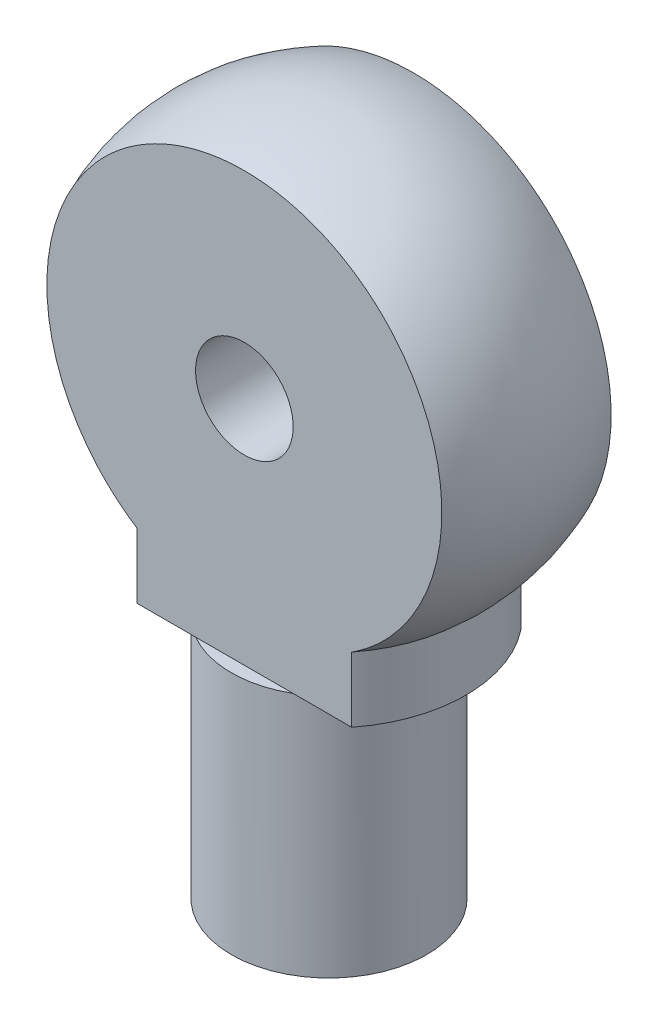
ISO-10303-21;
HEADER;
FILE_DESCRIPTION(('STEP AP214'),'2;1');
FILE_NAME('part.step','',(''),(''),'','','');
FILE_SCHEMA(('AUTOMOTIVE_DESIGN { 1 0 10303 214 1 1 1 1 }'));
ENDSEC;
DATA;
#1=APPLICATION_CONTEXT('core data for automotive mechanical design processes');
#2=APPLICATION_PROTOCOL_DEFINITION('international standard','automotive_design',2000,#1);
#3=PRODUCT_CONTEXT('',#1,'mechanical');
#4=PRODUCT('Part','Part','',(#3));
#5=PRODUCT_RELATED_PRODUCT_CATEGORY('part','',(#4));
#6=PRODUCT_DEFINITION_FORMATION('','',#4);
#7=PRODUCT_DEFINITION_CONTEXT('part definition',#1,'design');
#8=PRODUCT_DEFINITION('design','',#6,#7);
#9=PRODUCT_DEFINITION_SHAPE('','',#8);
#10=(LENGTH_UNIT() NAMED_UNIT(*) SI_UNIT(.MILLI.,.METRE.));
#11=(NAMED_UNIT(*) PLANE_ANGLE_UNIT() SI_UNIT($,.RADIAN.));
#12=(NAMED_UNIT(*) SI_UNIT($,.STERADIAN.) SOLID_ANGLE_UNIT());
#13=UNCERTAINTY_MEASURE_WITH_UNIT(LENGTH_MEASURE(1.E-05),#10,'distance_accuracy_value','');
#14=(GEOMETRIC_REPRESENTATION_CONTEXT(3) GLOBAL_UNCERTAINTY_ASSIGNED_CONTEXT((#13)) GLOBAL_UNIT_ASSIGNED_CONTEXT((#10,
#11,#12)) REPRESENTATION_CONTEXT('',''));
#15=CARTESIAN_POINT('',(0.,0.,0.));
#16=DIRECTION('',(0.,0.,1.));
#17=DIRECTION('',(1.,0.,0.));
#18=AXIS2_PLACEMENT_3D('',#15,#16,#17);
#19=CARTESIAN_POINT('',(0.,19.05,10.668));
#20=DIRECTION('',(0.,1.,0.));
#21=DIRECTION('',(0.,0.,1.));
#22=AXIS2_PLACEMENT_3D('',#19,#20,#21);
#23=PLANE('',#22);
#24=CARTESIAN_POINT('',(0.,19.05,0.));
#25=DIRECTION('',(0.,-1.,0.));
#26=DIRECTION('',(0.,0.,-1.));
#27=AXIS2_PLACEMENT_3D('',#24,#25,#26);
#28=CIRCLE('',#27,10.668);
#29=CARTESIAN_POINT('',(8.37815063125509,19.05,-6.604));
#30=VERTEX_POINT('',#29);
#31=CARTESIAN_POINT('',(8.37815063125509,19.05,6.604));
#32=VERTEX_POINT('',#31);
#33=EDGE_CURVE('E112',#30,#32,#28,.T.);
#34=ORIENTED_EDGE('',*,*,#33,.T.);
#35=DIRECTION('',(1.,0.,0.));
#36=VECTOR('',#35,1.);
#37=CARTESIAN_POINT('',(-16.764,19.05,6.604));
#38=LINE('',#37,#36);
#39=CARTESIAN_POINT('',(3.80152390496232,19.05,6.604));
#40=VERTEX_POINT('',#39);
#41=EDGE_CURVE('E96',#40,#32,#38,.T.);
#42=ORIENTED_EDGE('',*,*,#41,.F.);
#43=CARTESIAN_POINT('',(0.,19.05,0.));
#44=DIRECTION('',(0.,1.,0.));
#45=DIRECTION('',(0.,0.,1.));
#46=AXIS2_PLACEMENT_3D('',#43,#44,#45);
#47=CIRCLE('',#46,7.62);
#48=CARTESIAN_POINT('',(3.80152390496232,19.05,-6.604));
#49=VERTEX_POINT('',#48);
#50=EDGE_CURVE('E123',#40,#49,#47,.T.);
#51=ORIENTED_EDGE('',*,*,#50,.T.);
#52=DIRECTION('',(1.,0.,0.));
#53=VECTOR('',#52,1.);
#54=CARTESIAN_POINT('',(-16.764,19.05,-6.604));
#55=LINE('',#54,#53);
#56=EDGE_CURVE('E98',#49,#30,#55,.T.);
#57=ORIENTED_EDGE('',*,*,#56,.T.);
#58=EDGE_LOOP('',(#34,#42,#51,#57));
#59=FACE_BOUND('',#58,.T.);
#60=ADVANCED_FACE('F33',(#59),#23,.F.);
#61=CARTESIAN_POINT('',(0.,19.05,0.));
#62=DIRECTION('',(0.,-1.,0.));
#63=DIRECTION('',(0.,0.,-1.));
#64=AXIS2_PLACEMENT_3D('',#61,#62,#63);
#65=CYLINDRICAL_SURFACE('',#64,10.668);
#66=CARTESIAN_POINT('',(0.,24.13,0.));
#67=DIRECTION('',(0.,-1.,0.));
#68=DIRECTION('',(0.,0.,-1.));
#69=AXIS2_PLACEMENT_3D('',#66,#67,#68);
#70=CIRCLE('',#69,10.668);
#71=CARTESIAN_POINT('',(8.37815063125509,24.13,-6.604));
#72=VERTEX_POINT('',#71);
#73=CARTESIAN_POINT('',(8.37815063125508,24.13,6.604));
#74=VERTEX_POINT('',#73);
#75=EDGE_CURVE('E119',#72,#74,#70,.T.);
#76=ORIENTED_EDGE('',*,*,#75,.T.);
#77=DIRECTION('',(0.,-1.,0.));
#78=VECTOR('',#77,1.);
#79=CARTESIAN_POINT('',(8.37815063125509,19.05,6.604));
#80=LINE('',#79,#78);
#81=EDGE_CURVE('E11',#74,#32,#80,.T.);
#82=ORIENTED_EDGE('',*,*,#81,.T.);
#83=ORIENTED_EDGE('',*,*,#33,.F.);
#84=DIRECTION('',(0.,-1.,0.));
#85=VECTOR('',#84,1.);
#86=CARTESIAN_POINT('',(8.37815063125509,19.05,-6.604));
#87=LINE('',#86,#85);
#88=EDGE_CURVE('E106',#30,#72,#87,.F.);
#89=ORIENTED_EDGE('',*,*,#88,.T.);
#90=EDGE_LOOP('',(#76,#82,#83,#89));
#91=FACE_BOUND('',#90,.T.);
#92=ADVANCED_FACE('F161',(#91),#65,.T.);
#93=CARTESIAN_POINT('',(0.,19.05,0.));
#94=DIRECTION('',(0.,-1.,0.));
#95=DIRECTION('',(0.,0.,-1.));
#96=AXIS2_PLACEMENT_3D('',#93,#94,#95);
#97=CYLINDRICAL_SURFACE('',#96,7.62);
#98=ORIENTED_EDGE('',*,*,#50,.F.);
#99=CARTESIAN_POINT('',(0.,19.05,0.));
#100=DIRECTION('',(0.,-1.,0.));
#101=DIRECTION('',(0.,0.,-1.));
#102=AXIS2_PLACEMENT_3D('',#99,#100,#101);
#103=CIRCLE('',#102,7.62);
#104=CARTESIAN_POINT('',(-3.80152390496232,19.05,6.604));
#105=VERTEX_POINT('',#104);
#106=EDGE_CURVE('E115',#40,#105,#103,.T.);
#107=ORIENTED_EDGE('',*,*,#106,.T.);
#108=CARTESIAN_POINT('',(-3.80152390496232,19.05,-6.604));
#109=VERTEX_POINT('',#108);
#110=EDGE_CURVE('E126',#109,#105,#47,.T.);
#111=ORIENTED_EDGE('',*,*,#110,.F.);
#112=CARTESIAN_POINT('',(0.,19.05,0.));
#113=DIRECTION('',(0.,-1.,0.));
#114=DIRECTION('',(0.,0.,-1.));
#115=AXIS2_PLACEMENT_3D('',#112,#113,#114);
#116=CIRCLE('',#115,7.62);
#117=EDGE_CURVE('E133',#109,#49,#116,.T.);
#118=ORIENTED_EDGE('',*,*,#117,.T.);
#119=EDGE_LOOP('',(#98,#107,#111,#118));
#120=FACE_BOUND('',#119,.T.);
#121=CARTESIAN_POINT('',(0.,0.,0.));
#122=DIRECTION('',(0.,1.,0.));
#123=DIRECTION('',(0.,0.,1.));
#124=AXIS2_PLACEMENT_3D('',#121,#122,#123);
#125=CIRCLE('',#124,7.62);
#126=CARTESIAN_POINT('',(0.,0.,7.62));
#127=VERTEX_POINT('',#126);
#128=EDGE_CURVE('E122',#127,#127,#125,.T.);
#129=ORIENTED_EDGE('',*,*,#128,.T.);
#130=EDGE_LOOP('',(#129));
#131=FACE_BOUND('',#130,.T.);
#132=ADVANCED_FACE('F35',(#120,#131),#97,.T.);
#133=CARTESIAN_POINT('',(0.,0.,0.));
#134=DIRECTION('',(0.,1.,0.));
#135=DIRECTION('',(0.,0.,1.));
#136=AXIS2_PLACEMENT_3D('',#133,#134,#135);
#137=PLANE('',#136);
#138=ORIENTED_EDGE('',*,*,#128,.F.);
#139=EDGE_LOOP('',(#138));
#140=FACE_BOUND('',#139,.T.);
#141=ADVANCED_FACE('F171',(#140),#137,.F.);
#142=ORIENTED_EDGE('',*,*,#110,.T.);
#143=CARTESIAN_POINT('',(-8.37815063125509,19.05,6.604));
#144=VERTEX_POINT('',#143);
#145=EDGE_CURVE('E111',#144,#105,#38,.T.);
#146=ORIENTED_EDGE('',*,*,#145,.F.);
#147=CARTESIAN_POINT('',(-8.37815063125509,19.05,-6.604));
#148=VERTEX_POINT('',#147);
#149=EDGE_CURVE('E103',#144,#148,#28,.T.);
#150=ORIENTED_EDGE('',*,*,#149,.T.);
#151=EDGE_CURVE('E86',#148,#109,#55,.T.);
#152=ORIENTED_EDGE('',*,*,#151,.T.);
#153=EDGE_LOOP('',(#142,#146,#150,#152));
#154=FACE_BOUND('',#153,.T.);
#155=ADVANCED_FACE('F109',(#154),#23,.F.);
#156=CARTESIAN_POINT('',(0.,37.0615688143396,0.));
#157=DIRECTION('',(0.,-1.,0.));
#158=DIRECTION('',(0.,0.,-1.));
#159=AXIS2_PLACEMENT_3D('',#156,#157,#158);
#160=SPHERICAL_SURFACE('',#159,16.764);
#161=CARTESIAN_POINT('',(-8.37815063125508,24.13,6.604));
#162=VERTEX_POINT('',#161);
#163=CARTESIAN_POINT('',(-8.37815063125508,24.13,-6.604));
#164=VERTEX_POINT('',#163);
#165=EDGE_CURVE('E105',#162,#164,#70,.T.);
#166=ORIENTED_EDGE('',*,*,#165,.F.);
#167=CARTESIAN_POINT('',(0.,37.0615688143396,6.604));
#168=DIRECTION('',(0.,0.,-1.));
#169=DIRECTION('',(-1.,0.,0.));
#170=AXIS2_PLACEMENT_3D('',#167,#168,#169);
#171=CIRCLE('',#170,15.4084029023128);
#172=EDGE_CURVE('E49',#162,#74,#171,.T.);
#173=ORIENTED_EDGE('',*,*,#172,.T.);
#174=ORIENTED_EDGE('',*,*,#75,.F.);
#175=CARTESIAN_POINT('',(0.,37.0615688143396,-6.604));
#176=DIRECTION('',(0.,0.,1.));
#177=DIRECTION('',(1.,0.,0.));
#178=AXIS2_PLACEMENT_3D('',#175,#176,#177);
#179=CIRCLE('',#178,15.4084029023128);
#180=EDGE_CURVE('E57',#72,#164,#179,.T.);
#181=ORIENTED_EDGE('',*,*,#180,.T.);
#182=EDGE_LOOP('',(#166,#173,#174,#181));
#183=FACE_BOUND('',#182,.T.);
#184=ADVANCED_FACE('F131',(#183),#160,.T.);
#185=ORIENTED_EDGE('',*,*,#149,.F.);
#186=DIRECTION('',(0.,-1.,0.));
#187=VECTOR('',#186,1.);
#188=CARTESIAN_POINT('',(-8.37815063125509,19.05,6.604));
#189=LINE('',#188,#187);
#190=EDGE_CURVE('E42',#144,#162,#189,.F.);
#191=ORIENTED_EDGE('',*,*,#190,.T.);
#192=ORIENTED_EDGE('',*,*,#165,.T.);
#193=DIRECTION('',(0.,-1.,0.));
#194=VECTOR('',#193,1.);
#195=CARTESIAN_POINT('',(-8.37815063125509,19.05,-6.604));
#196=LINE('',#195,#194);
#197=EDGE_CURVE('E89',#164,#148,#196,.T.);
#198=ORIENTED_EDGE('',*,*,#197,.T.);
#199=EDGE_LOOP('',(#185,#191,#192,#198));
#200=FACE_BOUND('',#199,.T.);
#201=ADVANCED_FACE('F102',(#200),#65,.T.);
#202=CARTESIAN_POINT('',(-16.764,19.05,-6.604));
#203=DIRECTION('',(0.,0.,1.));
#204=DIRECTION('',(1.,0.,0.));
#205=AXIS2_PLACEMENT_3D('',#202,#203,#204);
#206=PLANE('',#205);
#207=CARTESIAN_POINT('',(0.,37.0615688143396,-6.604));
#208=DIRECTION('',(0.,0.,-1.));
#209=DIRECTION('',(-1.,0.,0.));
#210=AXIS2_PLACEMENT_3D('',#207,#208,#209);
#211=CIRCLE('',#210,3.81);
#212=CARTESIAN_POINT('',(-3.81,37.0615688143396,-6.604));
#213=VERTEX_POINT('',#212);
#214=EDGE_CURVE('E142',#213,#213,#211,.T.);
#215=ORIENTED_EDGE('',*,*,#214,.F.);
#216=EDGE_LOOP('',(#215));
#217=FACE_BOUND('',#216,.T.);
#218=ORIENTED_EDGE('',*,*,#180,.F.);
#219=ORIENTED_EDGE('',*,*,#88,.F.);
#220=ORIENTED_EDGE('',*,*,#56,.F.);
#221=EDGE_CURVE('E91',#109,#49,#55,.T.);
#222=ORIENTED_EDGE('',*,*,#221,.F.);
#223=ORIENTED_EDGE('',*,*,#151,.F.);
#224=ORIENTED_EDGE('',*,*,#197,.F.);
#225=EDGE_LOOP('',(#218,#219,#220,#222,#223,#224));
#226=FACE_BOUND('',#225,.T.);
#227=ADVANCED_FACE('F88',(#217,#226),#206,.F.);
#228=CARTESIAN_POINT('',(-16.764,19.05,-6.604));
#229=DIRECTION('',(0.,-1.,0.));
#230=DIRECTION('',(0.,0.,-1.));
#231=AXIS2_PLACEMENT_3D('',#228,#229,#230);
#232=PLANE('',#231);
#233=ORIENTED_EDGE('',*,*,#221,.T.);
#234=ORIENTED_EDGE('',*,*,#117,.F.);
#235=EDGE_LOOP('',(#233,#234));
#236=FACE_BOUND('',#235,.T.);
#237=ADVANCED_FACE('F190',(#236),#232,.F.);
#238=CARTESIAN_POINT('',(-16.764,19.05,6.604));
#239=DIRECTION('',(0.,0.,-1.));
#240=DIRECTION('',(-1.,0.,0.));
#241=AXIS2_PLACEMENT_3D('',#238,#239,#240);
#242=PLANE('',#241);
#243=CARTESIAN_POINT('',(0.,37.0615688143396,6.604));
#244=DIRECTION('',(0.,0.,-1.));
#245=DIRECTION('',(-1.,0.,0.));
#246=AXIS2_PLACEMENT_3D('',#243,#244,#245);
#247=CIRCLE('',#246,3.81);
#248=CARTESIAN_POINT('',(-3.81,37.0615688143396,6.604));
#249=VERTEX_POINT('',#248);
#250=EDGE_CURVE('E37',#249,#249,#247,.T.);
#251=ORIENTED_EDGE('',*,*,#250,.T.);
#252=EDGE_LOOP('',(#251));
#253=FACE_BOUND('',#252,.T.);
#254=ORIENTED_EDGE('',*,*,#172,.F.);
#255=ORIENTED_EDGE('',*,*,#190,.F.);
#256=ORIENTED_EDGE('',*,*,#145,.T.);
#257=EDGE_CURVE('E141',#105,#40,#38,.T.);
#258=ORIENTED_EDGE('',*,*,#257,.T.);
#259=ORIENTED_EDGE('',*,*,#41,.T.);
#260=ORIENTED_EDGE('',*,*,#81,.F.);
#261=EDGE_LOOP('',(#254,#255,#256,#258,#259,#260));
#262=FACE_BOUND('',#261,.T.);
#263=ADVANCED_FACE('F149',(#253,#262),#242,.F.);
#264=CARTESIAN_POINT('',(-16.764,19.05,6.604));
#265=DIRECTION('',(0.,-1.,0.));
#266=DIRECTION('',(0.,0.,-1.));
#267=AXIS2_PLACEMENT_3D('',#264,#265,#266);
#268=PLANE('',#267);
#269=ORIENTED_EDGE('',*,*,#257,.F.);
#270=ORIENTED_EDGE('',*,*,#106,.F.);
#271=EDGE_LOOP('',(#269,#270));
#272=FACE_BOUND('',#271,.T.);
#273=ADVANCED_FACE('F153',(#272),#268,.F.);
#274=CARTESIAN_POINT('',(0.,37.0615688143396,7.62));
#275=DIRECTION('',(0.,0.,-1.));
#276=DIRECTION('',(-1.,0.,0.));
#277=AXIS2_PLACEMENT_3D('',#274,#275,#276);
#278=CYLINDRICAL_SURFACE('',#277,3.81);
#279=CARTESIAN_POINT('',(-3.81,37.0615688143396,-6.604));
#280=CARTESIAN_POINT('',(-3.81,37.0615688143396,-6.46641666666667));
#281=CARTESIAN_POINT('',(-3.81,37.0615688143396,-6.32883333333333));
#282=CARTESIAN_POINT('',(-3.81,37.0615688143396,-6.05366666666667));
#283=CARTESIAN_POINT('',(-3.81,37.0615688143396,-5.91608333333333));
#284=CARTESIAN_POINT('',(-3.81,37.0615688143396,-5.64091666666667));
#285=CARTESIAN_POINT('',(-3.81,37.0615688143396,-5.50333333333333));
#286=CARTESIAN_POINT('',(-3.81,37.0615688143396,-5.22816666666667));
#287=CARTESIAN_POINT('',(-3.81,37.0615688143396,-5.09058333333333));
#288=CARTESIAN_POINT('',(-3.81,37.0615688143396,-4.81541666666667));
#289=CARTESIAN_POINT('',(-3.81,37.0615688143396,-4.67783333333333));
#290=CARTESIAN_POINT('',(-3.81,37.0615688143396,-4.40266666666667));
#291=CARTESIAN_POINT('',(-3.81,37.0615688143396,-4.26508333333333));
#292=CARTESIAN_POINT('',(-3.81,37.0615688143396,-3.98991666666667));
#293=CARTESIAN_POINT('',(-3.81,37.0615688143396,-3.85233333333333));
#294=CARTESIAN_POINT('',(-3.81,37.0615688143396,-3.57716666666667));
#295=CARTESIAN_POINT('',(-3.81,37.0615688143396,-3.43958333333333));
#296=CARTESIAN_POINT('',(-3.81,37.0615688143396,-3.16441666666667));
#297=CARTESIAN_POINT('',(-3.81,37.0615688143396,-3.02683333333333));
#298=CARTESIAN_POINT('',(-3.81,37.0615688143396,-2.75166666666667));
#299=CARTESIAN_POINT('',(-3.81,37.0615688143396,-2.61408333333333));
#300=CARTESIAN_POINT('',(-3.81,37.0615688143396,-2.33891666666667));
#301=CARTESIAN_POINT('',(-3.81,37.0615688143396,-2.20133333333333));
#302=CARTESIAN_POINT('',(-3.81,37.0615688143396,-1.92616666666667));
#303=CARTESIAN_POINT('',(-3.81,37.0615688143396,-1.78858333333333));
#304=CARTESIAN_POINT('',(-3.81,37.0615688143396,-1.51341666666667));
#305=CARTESIAN_POINT('',(-3.81,37.0615688143396,-1.37583333333333));
#306=CARTESIAN_POINT('',(-3.81,37.0615688143396,-1.10066666666667));
#307=CARTESIAN_POINT('',(-3.81,37.0615688143396,-0.963083333333332));
#308=CARTESIAN_POINT('',(-3.81,37.0615688143396,-0.687916666666666));
#309=CARTESIAN_POINT('',(-3.81,37.0615688143396,-0.550333333333332));
#310=CARTESIAN_POINT('',(-3.81,37.0615688143396,-0.275166666666666));
#311=CARTESIAN_POINT('',(-3.81,37.0615688143396,-0.137583333333333));
#312=CARTESIAN_POINT('',(-3.81,37.0615688143396,0.137583333333333));
#313=CARTESIAN_POINT('',(-3.81,37.0615688143396,0.275166666666667));
#314=CARTESIAN_POINT('',(-3.81,37.0615688143396,0.550333333333333));
#315=CARTESIAN_POINT('',(-3.81,37.0615688143396,0.687916666666667));
#316=CARTESIAN_POINT('',(-3.81,37.0615688143396,0.963083333333333));
#317=CARTESIAN_POINT('',(-3.81,37.0615688143396,1.10066666666667));
#318=CARTESIAN_POINT('',(-3.81,37.0615688143396,1.37583333333333));
#319=CARTESIAN_POINT('',(-3.81,37.0615688143396,1.51341666666667));
#320=CARTESIAN_POINT('',(-3.81,37.0615688143396,1.78858333333333));
#321=CARTESIAN_POINT('',(-3.81,37.0615688143396,1.92616666666667));
#322=CARTESIAN_POINT('',(-3.81,37.0615688143396,2.20133333333333));
#323=CARTESIAN_POINT('',(-3.81,37.0615688143396,2.33891666666667));
#324=CARTESIAN_POINT('',(-3.81,37.0615688143396,2.61408333333333));
#325=CARTESIAN_POINT('',(-3.81,37.0615688143396,2.75166666666667));
#326=CARTESIAN_POINT('',(-3.81,37.0615688143396,3.02683333333333));
#327=CARTESIAN_POINT('',(-3.81,37.0615688143396,3.16441666666667));
#328=CARTESIAN_POINT('',(-3.81,37.0615688143396,3.43958333333333));
#329=CARTESIAN_POINT('',(-3.81,37.0615688143396,3.57716666666667));
#330=CARTESIAN_POINT('',(-3.81,37.0615688143396,3.85233333333333));
#331=CARTESIAN_POINT('',(-3.81,37.0615688143396,3.98991666666667));
#332=CARTESIAN_POINT('',(-3.81,37.0615688143396,4.26508333333333));
#333=CARTESIAN_POINT('',(-3.81,37.0615688143396,4.40266666666667));
#334=CARTESIAN_POINT('',(-3.81,37.0615688143396,4.67783333333333));
#335=CARTESIAN_POINT('',(-3.81,37.0615688143396,4.81541666666667));
#336=CARTESIAN_POINT('',(-3.81,37.0615688143396,5.09058333333333));
#337=CARTESIAN_POINT('',(-3.81,37.0615688143396,5.22816666666667));
#338=CARTESIAN_POINT('',(-3.81,37.0615688143396,5.50333333333333));
#339=CARTESIAN_POINT('',(-3.81,37.0615688143396,5.64091666666667));
#340=CARTESIAN_POINT('',(-3.81,37.0615688143396,5.91608333333333));
#341=CARTESIAN_POINT('',(-3.81,37.0615688143396,6.05366666666667));
#342=CARTESIAN_POINT('',(-3.81,37.0615688143396,6.32883333333333));
#343=CARTESIAN_POINT('',(-3.81,37.0615688143396,6.46641666666667));
#344=CARTESIAN_POINT('',(-3.81,37.0615688143396,6.604));
#345=B_SPLINE_CURVE_WITH_KNOTS('',3,(#279,#280,#281,#282,#283,#284,#285,#286,#287,#288,#289,
#290,#291,#292,#293,#294,#295,#296,#297,#298,#299,#300,#301,#302,#303,#304,#305,#306,#307,#308,
#309,#310,#311,#312,#313,#314,#315,#316,#317,#318,#319,#320,#321,#322,#323,#324,#325,#326,#327,
#328,#329,#330,#331,#332,#333,#334,#335,#336,#337,#338,#339,#340,#341,#342,#343,#344),
.UNSPECIFIED.,.F.,.F.,(4,2,2,2,2,2,2,2,2,2,2,2,2,2,2,2,2,2,2,2,2,2,2,2,2,2,2,2,2,2,2,2,4),(0.,
0.41275,0.8255,1.23825,1.651,2.06375,2.4765,2.88925,3.302,3.71475,4.1275,4.54025,4.953,5.36575,
5.7785,6.19125,6.604,7.01675,7.4295,7.84225,8.255,8.66775,9.0805,9.49325,9.906,10.31875,10.7315,
11.14425,11.557,11.96975,12.3825,12.79525,13.208),.UNSPECIFIED.);
#346=EDGE_CURVE('BSEAM151',#213,#249,#345,.T.);
#347=ORIENTED_EDGE('',*,*,#214,.T.);
#348=ORIENTED_EDGE('',*,*,#250,.F.);
#349=ORIENTED_EDGE('',*,*,#346,.T.);
#350=ORIENTED_EDGE('',*,*,#346,.F.);
#351=EDGE_LOOP('',(#347,#349,#348,#350));
#352=FACE_BOUND('',#351,.T.);
#353=ADVANCED_FACE('F151',(#352),#278,.F.);
#354=CLOSED_SHELL('',(#60,#92,#132,#141,#155,#184,#201,#227,#237,#263,#273,#353));
#355=MANIFOLD_SOLID_BREP('B2',#354);
#356=ADVANCED_BREP_SHAPE_REPRESENTATION('',(#18,#355),#14);
#357=SHAPE_DEFINITION_REPRESENTATION(#9,#356);
ENDSEC;
END-ISO-10303-21;
